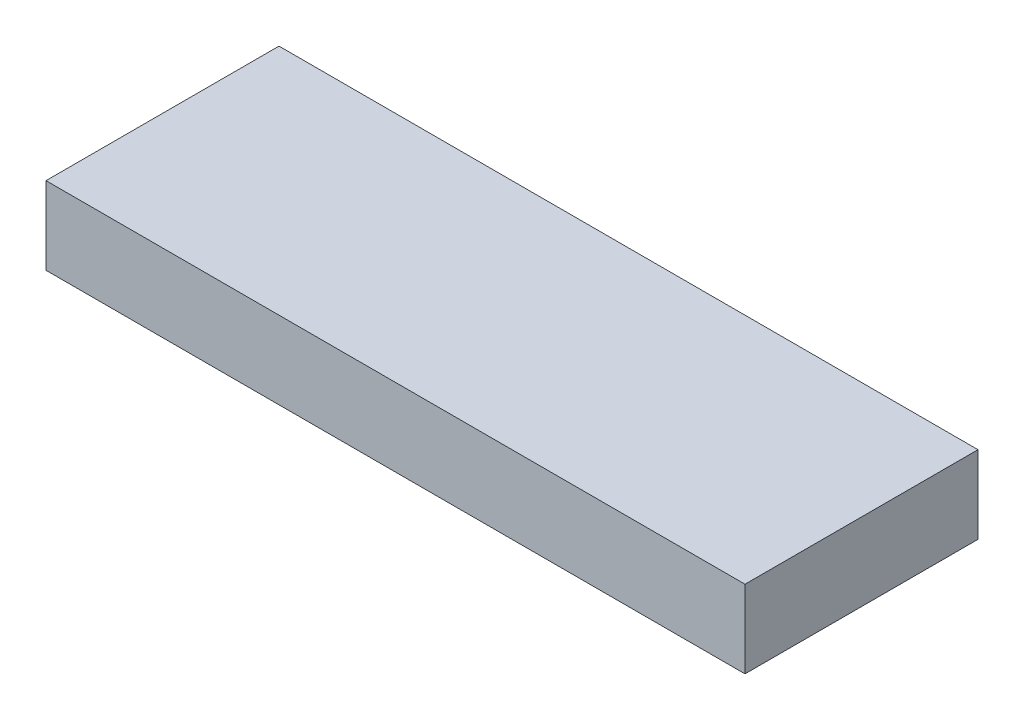
ISO-10303-21;
HEADER;
FILE_DESCRIPTION(('STEP AP214'),'2;1');
FILE_NAME('part.step','',(''),(''),'','','');
FILE_SCHEMA(('AUTOMOTIVE_DESIGN { 1 0 10303 214 1 1 1 1 }'));
ENDSEC;
DATA;
#1=APPLICATION_CONTEXT('core data for automotive mechanical design processes');
#2=APPLICATION_PROTOCOL_DEFINITION('international standard','automotive_design',2000,#1);
#3=PRODUCT_CONTEXT('',#1,'mechanical');
#4=PRODUCT('Part','Part','',(#3));
#5=PRODUCT_RELATED_PRODUCT_CATEGORY('part','',(#4));
#6=PRODUCT_DEFINITION_FORMATION('','',#4);
#7=PRODUCT_DEFINITION_CONTEXT('part definition',#1,'design');
#8=PRODUCT_DEFINITION('design','',#6,#7);
#9=PRODUCT_DEFINITION_SHAPE('','',#8);
#10=(LENGTH_UNIT() NAMED_UNIT(*) SI_UNIT(.MILLI.,.METRE.));
#11=(NAMED_UNIT(*) PLANE_ANGLE_UNIT() SI_UNIT($,.RADIAN.));
#12=(NAMED_UNIT(*) SI_UNIT($,.STERADIAN.) SOLID_ANGLE_UNIT());
#13=UNCERTAINTY_MEASURE_WITH_UNIT(LENGTH_MEASURE(1.E-05),#10,'distance_accuracy_value','');
#14=(GEOMETRIC_REPRESENTATION_CONTEXT(3) GLOBAL_UNCERTAINTY_ASSIGNED_CONTEXT((#13)) GLOBAL_UNIT_ASSIGNED_CONTEXT((#10,
#11,#12)) REPRESENTATION_CONTEXT('',''));
#15=CARTESIAN_POINT('',(0.,0.,0.));
#16=DIRECTION('',(0.,0.,1.));
#17=DIRECTION('',(1.,0.,0.));
#18=AXIS2_PLACEMENT_3D('',#15,#16,#17);
#19=CARTESIAN_POINT('',(45.,10.,15.));
#20=DIRECTION('',(-1.,0.,0.));
#21=DIRECTION('',(0.,0.,1.));
#22=AXIS2_PLACEMENT_3D('',#19,#20,#21);
#23=PLANE('',#22);
#24=DIRECTION('',(0.,0.,-1.));
#25=VECTOR('',#24,1.);
#26=CARTESIAN_POINT('',(45.,0.,15.));
#27=LINE('',#26,#25);
#28=CARTESIAN_POINT('',(45.,0.,15.));
#29=VERTEX_POINT('',#28);
#30=CARTESIAN_POINT('',(45.,0.,-15.));
#31=VERTEX_POINT('',#30);
#32=EDGE_CURVE('E107',#29,#31,#27,.T.);
#33=ORIENTED_EDGE('',*,*,#32,.T.);
#34=DIRECTION('',(0.,-1.,0.));
#35=VECTOR('',#34,1.);
#36=CARTESIAN_POINT('',(45.,10.,-15.));
#37=LINE('',#36,#35);
#38=CARTESIAN_POINT('',(45.,10.,-15.));
#39=VERTEX_POINT('',#38);
#40=EDGE_CURVE('E11',#39,#31,#37,.T.);
#41=ORIENTED_EDGE('',*,*,#40,.F.);
#42=DIRECTION('',(0.,0.,-1.));
#43=VECTOR('',#42,1.);
#44=CARTESIAN_POINT('',(45.,10.,15.));
#45=LINE('',#44,#43);
#46=CARTESIAN_POINT('',(45.,10.,15.));
#47=VERTEX_POINT('',#46);
#48=EDGE_CURVE('E91',#47,#39,#45,.T.);
#49=ORIENTED_EDGE('',*,*,#48,.F.);
#50=DIRECTION('',(0.,-1.,0.));
#51=VECTOR('',#50,1.);
#52=CARTESIAN_POINT('',(45.,10.,15.));
#53=LINE('',#52,#51);
#54=EDGE_CURVE('E103',#47,#29,#53,.T.);
#55=ORIENTED_EDGE('',*,*,#54,.T.);
#56=EDGE_LOOP('',(#33,#41,#49,#55));
#57=FACE_BOUND('',#56,.T.);
#58=ADVANCED_FACE('F39',(#57),#23,.F.);
#59=CARTESIAN_POINT('',(-45.,10.,-15.));
#60=DIRECTION('',(0.,0.,1.));
#61=DIRECTION('',(1.,0.,0.));
#62=AXIS2_PLACEMENT_3D('',#59,#60,#61);
#63=PLANE('',#62);
#64=DIRECTION('',(-1.,0.,0.));
#65=VECTOR('',#64,1.);
#66=CARTESIAN_POINT('',(-45.,0.,-15.));
#67=LINE('',#66,#65);
#68=CARTESIAN_POINT('',(-45.,0.,-15.));
#69=VERTEX_POINT('',#68);
#70=EDGE_CURVE('E96',#31,#69,#67,.T.);
#71=ORIENTED_EDGE('',*,*,#70,.T.);
#72=DIRECTION('',(0.,-1.,0.));
#73=VECTOR('',#72,1.);
#74=CARTESIAN_POINT('',(-45.,10.,-15.));
#75=LINE('',#74,#73);
#76=CARTESIAN_POINT('',(-45.,10.,-15.));
#77=VERTEX_POINT('',#76);
#78=EDGE_CURVE('E48',#77,#69,#75,.T.);
#79=ORIENTED_EDGE('',*,*,#78,.F.);
#80=DIRECTION('',(-1.,0.,0.));
#81=VECTOR('',#80,1.);
#82=CARTESIAN_POINT('',(-45.,10.,-15.));
#83=LINE('',#82,#81);
#84=EDGE_CURVE('E86',#39,#77,#83,.T.);
#85=ORIENTED_EDGE('',*,*,#84,.F.);
#86=ORIENTED_EDGE('',*,*,#40,.T.);
#87=EDGE_LOOP('',(#71,#79,#85,#86));
#88=FACE_BOUND('',#87,.T.);
#89=ADVANCED_FACE('F95',(#88),#63,.F.);
#90=CARTESIAN_POINT('',(-45.,10.,15.));
#91=DIRECTION('',(1.,0.,0.));
#92=DIRECTION('',(0.,0.,-1.));
#93=AXIS2_PLACEMENT_3D('',#90,#91,#92);
#94=PLANE('',#93);
#95=DIRECTION('',(0.,0.,1.));
#96=VECTOR('',#95,1.);
#97=CARTESIAN_POINT('',(-45.,0.,15.));
#98=LINE('',#97,#96);
#99=CARTESIAN_POINT('',(-45.,0.,15.));
#100=VERTEX_POINT('',#99);
#101=EDGE_CURVE('E73',#69,#100,#98,.T.);
#102=ORIENTED_EDGE('',*,*,#101,.T.);
#103=DIRECTION('',(0.,-1.,0.));
#104=VECTOR('',#103,1.);
#105=CARTESIAN_POINT('',(-45.,10.,15.));
#106=LINE('',#105,#104);
#107=CARTESIAN_POINT('',(-45.,10.,15.));
#108=VERTEX_POINT('',#107);
#109=EDGE_CURVE('E98',#108,#100,#106,.T.);
#110=ORIENTED_EDGE('',*,*,#109,.F.);
#111=DIRECTION('',(0.,0.,1.));
#112=VECTOR('',#111,1.);
#113=CARTESIAN_POINT('',(-45.,10.,15.));
#114=LINE('',#113,#112);
#115=EDGE_CURVE('E89',#77,#108,#114,.T.);
#116=ORIENTED_EDGE('',*,*,#115,.F.);
#117=ORIENTED_EDGE('',*,*,#78,.T.);
#118=EDGE_LOOP('',(#102,#110,#116,#117));
#119=FACE_BOUND('',#118,.T.);
#120=ADVANCED_FACE('F99',(#119),#94,.F.);
#121=CARTESIAN_POINT('',(-45.,10.,15.));
#122=DIRECTION('',(0.,0.,-1.));
#123=DIRECTION('',(-1.,0.,0.));
#124=AXIS2_PLACEMENT_3D('',#121,#122,#123);
#125=PLANE('',#124);
#126=DIRECTION('',(1.,0.,0.));
#127=VECTOR('',#126,1.);
#128=CARTESIAN_POINT('',(-45.,0.,15.));
#129=LINE('',#128,#127);
#130=EDGE_CURVE('E79',#100,#29,#129,.T.);
#131=ORIENTED_EDGE('',*,*,#130,.T.);
#132=ORIENTED_EDGE('',*,*,#54,.F.);
#133=DIRECTION('',(1.,0.,0.));
#134=VECTOR('',#133,1.);
#135=CARTESIAN_POINT('',(-45.,10.,15.));
#136=LINE('',#135,#134);
#137=EDGE_CURVE('E56',#108,#47,#136,.T.);
#138=ORIENTED_EDGE('',*,*,#137,.F.);
#139=ORIENTED_EDGE('',*,*,#109,.T.);
#140=EDGE_LOOP('',(#131,#132,#138,#139));
#141=FACE_BOUND('',#140,.T.);
#142=ADVANCED_FACE('F120',(#141),#125,.F.);
#143=CARTESIAN_POINT('',(0.,10.,0.));
#144=DIRECTION('',(0.,-1.,0.));
#145=DIRECTION('',(0.,0.,-1.));
#146=AXIS2_PLACEMENT_3D('',#143,#144,#145);
#147=PLANE('',#146);
#148=ORIENTED_EDGE('',*,*,#48,.T.);
#149=ORIENTED_EDGE('',*,*,#84,.T.);
#150=ORIENTED_EDGE('',*,*,#115,.T.);
#151=ORIENTED_EDGE('',*,*,#137,.T.);
#152=EDGE_LOOP('',(#148,#149,#150,#151));
#153=FACE_BOUND('',#152,.T.);
#154=ADVANCED_FACE('F87',(#153),#147,.F.);
#155=CARTESIAN_POINT('',(0.,0.,0.));
#156=DIRECTION('',(0.,-1.,0.));
#157=DIRECTION('',(0.,0.,-1.));
#158=AXIS2_PLACEMENT_3D('',#155,#156,#157);
#159=PLANE('',#158);
#160=ORIENTED_EDGE('',*,*,#32,.F.);
#161=ORIENTED_EDGE('',*,*,#130,.F.);
#162=ORIENTED_EDGE('',*,*,#101,.F.);
#163=ORIENTED_EDGE('',*,*,#70,.F.);
#164=EDGE_LOOP('',(#160,#161,#162,#163));
#165=FACE_BOUND('',#164,.T.);
#166=ADVANCED_FACE('F123',(#165),#159,.T.);
#167=CLOSED_SHELL('',(#58,#89,#120,#142,#154,#166));
#168=MANIFOLD_SOLID_BREP('B2',#167);
#169=ADVANCED_BREP_SHAPE_REPRESENTATION('',(#18,#168),#14);
#170=SHAPE_DEFINITION_REPRESENTATION(#9,#169);
ENDSEC;
END-ISO-10303-21;
